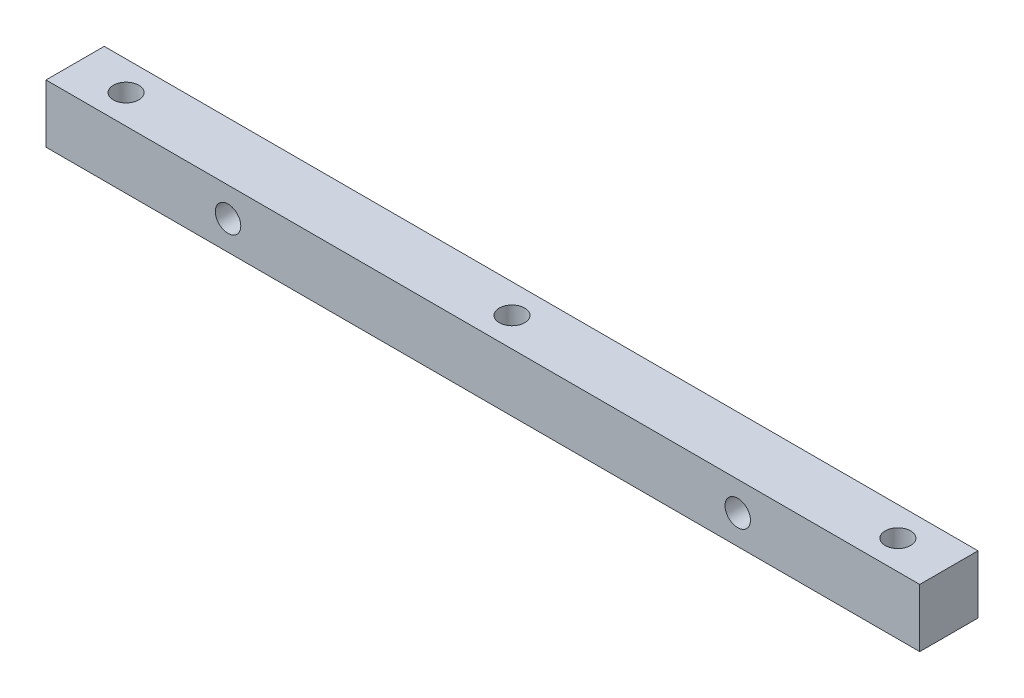
ISO-10303-21;
HEADER;
FILE_DESCRIPTION(('STEP AP214'),'2;1');
FILE_NAME('part.step','',(''),(''),'','','');
FILE_SCHEMA(('AUTOMOTIVE_DESIGN { 1 0 10303 214 1 1 1 1 }'));
ENDSEC;
DATA;
#1=APPLICATION_CONTEXT('core data for automotive mechanical design processes');
#2=APPLICATION_PROTOCOL_DEFINITION('international standard','automotive_design',2000,#1);
#3=PRODUCT_CONTEXT('',#1,'mechanical');
#4=PRODUCT('Part','Part','',(#3));
#5=PRODUCT_RELATED_PRODUCT_CATEGORY('part','',(#4));
#6=PRODUCT_DEFINITION_FORMATION('','',#4);
#7=PRODUCT_DEFINITION_CONTEXT('part definition',#1,'design');
#8=PRODUCT_DEFINITION('design','',#6,#7);
#9=PRODUCT_DEFINITION_SHAPE('','',#8);
#10=(LENGTH_UNIT() NAMED_UNIT(*) SI_UNIT(.MILLI.,.METRE.));
#11=(NAMED_UNIT(*) PLANE_ANGLE_UNIT() SI_UNIT($,.RADIAN.));
#12=(NAMED_UNIT(*) SI_UNIT($,.STERADIAN.) SOLID_ANGLE_UNIT());
#13=UNCERTAINTY_MEASURE_WITH_UNIT(LENGTH_MEASURE(1.E-05),#10,'distance_accuracy_value','');
#14=(GEOMETRIC_REPRESENTATION_CONTEXT(3) GLOBAL_UNCERTAINTY_ASSIGNED_CONTEXT((#13)) GLOBAL_UNIT_ASSIGNED_CONTEXT((#10,
#11,#12)) REPRESENTATION_CONTEXT('',''));
#15=CARTESIAN_POINT('',(0.,0.,0.));
#16=DIRECTION('',(0.,0.,1.));
#17=DIRECTION('',(1.,0.,0.));
#18=AXIS2_PLACEMENT_3D('',#15,#16,#17);
#19=CARTESIAN_POINT('',(0.,0.,8.));
#20=DIRECTION('',(0.,0.,-1.));
#21=DIRECTION('',(-1.,0.,0.));
#22=AXIS2_PLACEMENT_3D('',#19,#20,#21);
#23=PLANE('',#22);
#24=DIRECTION('',(0.,1.,0.));
#25=VECTOR('',#24,1.);
#26=CARTESIAN_POINT('',(60.,-4.,8.));
#27=LINE('',#26,#25);
#28=CARTESIAN_POINT('',(60.,-4.,8.));
#29=VERTEX_POINT('',#28);
#30=CARTESIAN_POINT('',(60.,4.,8.));
#31=VERTEX_POINT('',#30);
#32=EDGE_CURVE('E93',#29,#31,#27,.T.);
#33=ORIENTED_EDGE('',*,*,#32,.T.);
#34=DIRECTION('',(-1.,0.,0.));
#35=VECTOR('',#34,1.);
#36=CARTESIAN_POINT('',(-60.,4.,8.));
#37=LINE('',#36,#35);
#38=CARTESIAN_POINT('',(-60.,4.,8.));
#39=VERTEX_POINT('',#38);
#40=EDGE_CURVE('E88',#31,#39,#37,.T.);
#41=ORIENTED_EDGE('',*,*,#40,.T.);
#42=DIRECTION('',(0.,-1.,0.));
#43=VECTOR('',#42,1.);
#44=CARTESIAN_POINT('',(-60.,-4.,8.));
#45=LINE('',#44,#43);
#46=CARTESIAN_POINT('',(-60.,-4.,8.));
#47=VERTEX_POINT('',#46);
#48=EDGE_CURVE('E91',#39,#47,#45,.T.);
#49=ORIENTED_EDGE('',*,*,#48,.T.);
#50=DIRECTION('',(1.,0.,0.));
#51=VECTOR('',#50,1.);
#52=CARTESIAN_POINT('',(-60.,-4.,8.));
#53=LINE('',#52,#51);
#54=EDGE_CURVE('E58',#47,#29,#53,.T.);
#55=ORIENTED_EDGE('',*,*,#54,.T.);
#56=EDGE_LOOP('',(#33,#41,#49,#55));
#57=FACE_BOUND('',#56,.T.);
#58=CARTESIAN_POINT('',(-35.,0.,8.));
#59=DIRECTION('',(0.,0.,1.));
#60=DIRECTION('',(1.,0.,0.));
#61=AXIS2_PLACEMENT_3D('',#58,#59,#60);
#62=CIRCLE('',#61,1.75);
#63=CARTESIAN_POINT('',(-33.25,0.,8.));
#64=VERTEX_POINT('',#63);
#65=EDGE_CURVE('E108',#64,#64,#62,.T.);
#66=ORIENTED_EDGE('',*,*,#65,.F.);
#67=EDGE_LOOP('',(#66));
#68=FACE_BOUND('',#67,.T.);
#69=CARTESIAN_POINT('',(35.,0.,8.));
#70=DIRECTION('',(0.,0.,1.));
#71=DIRECTION('',(1.,0.,0.));
#72=AXIS2_PLACEMENT_3D('',#69,#70,#71);
#73=CIRCLE('',#72,1.75);
#74=CARTESIAN_POINT('',(36.75,0.,8.));
#75=VERTEX_POINT('',#74);
#76=EDGE_CURVE('E123',#75,#75,#73,.T.);
#77=ORIENTED_EDGE('',*,*,#76,.F.);
#78=EDGE_LOOP('',(#77));
#79=FACE_BOUND('',#78,.T.);
#80=ADVANCED_FACE('F41',(#57,#68,#79),#23,.F.);
#81=CARTESIAN_POINT('',(0.,0.,0.));
#82=DIRECTION('',(0.,0.,-1.));
#83=DIRECTION('',(-1.,0.,0.));
#84=AXIS2_PLACEMENT_3D('',#81,#82,#83);
#85=PLANE('',#84);
#86=CARTESIAN_POINT('',(-35.,0.,0.));
#87=DIRECTION('',(0.,0.,1.));
#88=DIRECTION('',(1.,0.,0.));
#89=AXIS2_PLACEMENT_3D('',#86,#87,#88);
#90=CIRCLE('',#89,1.75);
#91=CARTESIAN_POINT('',(-33.25,0.,0.));
#92=VERTEX_POINT('',#91);
#93=EDGE_CURVE('E120',#92,#92,#90,.T.);
#94=ORIENTED_EDGE('',*,*,#93,.T.);
#95=EDGE_LOOP('',(#94));
#96=FACE_BOUND('',#95,.T.);
#97=DIRECTION('',(0.,1.,0.));
#98=VECTOR('',#97,1.);
#99=CARTESIAN_POINT('',(60.,-4.,0.));
#100=LINE('',#99,#98);
#101=CARTESIAN_POINT('',(60.,-4.,0.));
#102=VERTEX_POINT('',#101);
#103=CARTESIAN_POINT('',(60.,4.,0.));
#104=VERTEX_POINT('',#103);
#105=EDGE_CURVE('E105',#102,#104,#100,.T.);
#106=ORIENTED_EDGE('',*,*,#105,.F.);
#107=DIRECTION('',(1.,0.,0.));
#108=VECTOR('',#107,1.);
#109=CARTESIAN_POINT('',(-60.,-4.,0.));
#110=LINE('',#109,#108);
#111=CARTESIAN_POINT('',(-60.,-4.,0.));
#112=VERTEX_POINT('',#111);
#113=EDGE_CURVE('E81',#112,#102,#110,.T.);
#114=ORIENTED_EDGE('',*,*,#113,.F.);
#115=DIRECTION('',(0.,-1.,0.));
#116=VECTOR('',#115,1.);
#117=CARTESIAN_POINT('',(-60.,-4.,0.));
#118=LINE('',#117,#116);
#119=CARTESIAN_POINT('',(-60.,4.,0.));
#120=VERTEX_POINT('',#119);
#121=EDGE_CURVE('E75',#120,#112,#118,.T.);
#122=ORIENTED_EDGE('',*,*,#121,.F.);
#123=DIRECTION('',(-1.,0.,0.));
#124=VECTOR('',#123,1.);
#125=CARTESIAN_POINT('',(-60.,4.,0.));
#126=LINE('',#125,#124);
#127=EDGE_CURVE('E97',#104,#120,#126,.T.);
#128=ORIENTED_EDGE('',*,*,#127,.F.);
#129=EDGE_LOOP('',(#106,#114,#122,#128));
#130=FACE_BOUND('',#129,.T.);
#131=CARTESIAN_POINT('',(35.,0.,0.));
#132=DIRECTION('',(0.,0.,1.));
#133=DIRECTION('',(1.,0.,0.));
#134=AXIS2_PLACEMENT_3D('',#131,#132,#133);
#135=CIRCLE('',#134,1.75);
#136=CARTESIAN_POINT('',(36.75,0.,0.));
#137=VERTEX_POINT('',#136);
#138=EDGE_CURVE('E126',#137,#137,#135,.T.);
#139=ORIENTED_EDGE('',*,*,#138,.T.);
#140=EDGE_LOOP('',(#139));
#141=FACE_BOUND('',#140,.T.);
#142=ADVANCED_FACE('F116',(#96,#130,#141),#85,.T.);
#143=CARTESIAN_POINT('',(60.,-4.,8.));
#144=DIRECTION('',(-1.,0.,0.));
#145=DIRECTION('',(0.,0.,1.));
#146=AXIS2_PLACEMENT_3D('',#143,#144,#145);
#147=PLANE('',#146);
#148=ORIENTED_EDGE('',*,*,#105,.T.);
#149=DIRECTION('',(0.,0.,-1.));
#150=VECTOR('',#149,1.);
#151=CARTESIAN_POINT('',(60.,4.,8.));
#152=LINE('',#151,#150);
#153=EDGE_CURVE('E11',#31,#104,#152,.T.);
#154=ORIENTED_EDGE('',*,*,#153,.F.);
#155=ORIENTED_EDGE('',*,*,#32,.F.);
#156=DIRECTION('',(0.,0.,-1.));
#157=VECTOR('',#156,1.);
#158=CARTESIAN_POINT('',(60.,-4.,8.));
#159=LINE('',#158,#157);
#160=EDGE_CURVE('E101',#29,#102,#159,.T.);
#161=ORIENTED_EDGE('',*,*,#160,.T.);
#162=EDGE_LOOP('',(#148,#154,#155,#161));
#163=FACE_BOUND('',#162,.T.);
#164=ADVANCED_FACE('F43',(#163),#147,.F.);
#165=CARTESIAN_POINT('',(-60.,4.,8.));
#166=DIRECTION('',(0.,-1.,0.));
#167=DIRECTION('',(0.,0.,-1.));
#168=AXIS2_PLACEMENT_3D('',#165,#166,#167);
#169=PLANE('',#168);
#170=CARTESIAN_POINT('',(53.,4.,4.));
#171=DIRECTION('',(0.,1.,0.));
#172=DIRECTION('',(0.,0.,1.));
#173=AXIS2_PLACEMENT_3D('',#170,#171,#172);
#174=CIRCLE('',#173,1.75);
#175=CARTESIAN_POINT('',(53.,4.,5.75));
#176=VERTEX_POINT('',#175);
#177=EDGE_CURVE('E144',#176,#176,#174,.T.);
#178=ORIENTED_EDGE('',*,*,#177,.F.);
#179=EDGE_LOOP('',(#178));
#180=FACE_BOUND('',#179,.T.);
#181=CARTESIAN_POINT('',(-53.,4.,4.00000000000001));
#182=DIRECTION('',(0.,1.,0.));
#183=DIRECTION('',(0.,0.,-1.));
#184=AXIS2_PLACEMENT_3D('',#181,#182,#183);
#185=CIRCLE('',#184,1.75000000000001);
#186=CARTESIAN_POINT('',(-53.,4.,2.25));
#187=VERTEX_POINT('',#186);
#188=EDGE_CURVE('E141',#187,#187,#185,.T.);
#189=ORIENTED_EDGE('',*,*,#188,.F.);
#190=EDGE_LOOP('',(#189));
#191=FACE_BOUND('',#190,.T.);
#192=CARTESIAN_POINT('',(0.,4.,4.));
#193=DIRECTION('',(0.,1.,0.));
#194=DIRECTION('',(0.,0.,1.));
#195=AXIS2_PLACEMENT_3D('',#192,#193,#194);
#196=CIRCLE('',#195,1.75);
#197=CARTESIAN_POINT('',(0.,4.,5.75));
#198=VERTEX_POINT('',#197);
#199=EDGE_CURVE('E135',#198,#198,#196,.T.);
#200=ORIENTED_EDGE('',*,*,#199,.F.);
#201=EDGE_LOOP('',(#200));
#202=FACE_BOUND('',#201,.T.);
#203=ORIENTED_EDGE('',*,*,#127,.T.);
#204=DIRECTION('',(0.,0.,-1.));
#205=VECTOR('',#204,1.);
#206=CARTESIAN_POINT('',(-60.,4.,8.));
#207=LINE('',#206,#205);
#208=EDGE_CURVE('E50',#39,#120,#207,.T.);
#209=ORIENTED_EDGE('',*,*,#208,.F.);
#210=ORIENTED_EDGE('',*,*,#40,.F.);
#211=ORIENTED_EDGE('',*,*,#153,.T.);
#212=EDGE_LOOP('',(#203,#209,#210,#211));
#213=FACE_BOUND('',#212,.T.);
#214=ADVANCED_FACE('F96',(#180,#191,#202,#213),#169,.F.);
#215=CARTESIAN_POINT('',(-60.,-4.,8.));
#216=DIRECTION('',(1.,0.,0.));
#217=DIRECTION('',(0.,1.,0.));
#218=AXIS2_PLACEMENT_3D('',#215,#216,#217);
#219=PLANE('',#218);
#220=ORIENTED_EDGE('',*,*,#121,.T.);
#221=DIRECTION('',(0.,0.,-1.));
#222=VECTOR('',#221,1.);
#223=CARTESIAN_POINT('',(-60.,-4.,8.));
#224=LINE('',#223,#222);
#225=EDGE_CURVE('E98',#47,#112,#224,.T.);
#226=ORIENTED_EDGE('',*,*,#225,.F.);
#227=ORIENTED_EDGE('',*,*,#48,.F.);
#228=ORIENTED_EDGE('',*,*,#208,.T.);
#229=EDGE_LOOP('',(#220,#226,#227,#228));
#230=FACE_BOUND('',#229,.T.);
#231=ADVANCED_FACE('F99',(#230),#219,.F.);
#232=CARTESIAN_POINT('',(-60.,-4.,8.));
#233=DIRECTION('',(0.,1.,0.));
#234=DIRECTION('',(-1.,0.,0.));
#235=AXIS2_PLACEMENT_3D('',#232,#233,#234);
#236=PLANE('',#235);
#237=CARTESIAN_POINT('',(53.,-4.,4.));
#238=DIRECTION('',(0.,1.,0.));
#239=DIRECTION('',(0.,0.,1.));
#240=AXIS2_PLACEMENT_3D('',#237,#238,#239);
#241=CIRCLE('',#240,1.75);
#242=CARTESIAN_POINT('',(53.,-4.,5.75));
#243=VERTEX_POINT('',#242);
#244=EDGE_CURVE('E129',#243,#243,#241,.T.);
#245=ORIENTED_EDGE('',*,*,#244,.T.);
#246=EDGE_LOOP('',(#245));
#247=FACE_BOUND('',#246,.T.);
#248=CARTESIAN_POINT('',(-53.,-4.,4.00000000000001));
#249=DIRECTION('',(0.,1.,0.));
#250=DIRECTION('',(0.,0.,-1.));
#251=AXIS2_PLACEMENT_3D('',#248,#249,#250);
#252=CIRCLE('',#251,1.75000000000001);
#253=CARTESIAN_POINT('',(-53.,-4.,2.25));
#254=VERTEX_POINT('',#253);
#255=EDGE_CURVE('E138',#254,#254,#252,.T.);
#256=ORIENTED_EDGE('',*,*,#255,.T.);
#257=EDGE_LOOP('',(#256));
#258=FACE_BOUND('',#257,.T.);
#259=CARTESIAN_POINT('',(0.,-4.,4.));
#260=DIRECTION('',(0.,1.,0.));
#261=DIRECTION('',(0.,0.,1.));
#262=AXIS2_PLACEMENT_3D('',#259,#260,#261);
#263=CIRCLE('',#262,1.75);
#264=CARTESIAN_POINT('',(0.,-4.,5.75));
#265=VERTEX_POINT('',#264);
#266=EDGE_CURVE('E132',#265,#265,#263,.T.);
#267=ORIENTED_EDGE('',*,*,#266,.T.);
#268=EDGE_LOOP('',(#267));
#269=FACE_BOUND('',#268,.T.);
#270=ORIENTED_EDGE('',*,*,#113,.T.);
#271=ORIENTED_EDGE('',*,*,#160,.F.);
#272=ORIENTED_EDGE('',*,*,#54,.F.);
#273=ORIENTED_EDGE('',*,*,#225,.T.);
#274=EDGE_LOOP('',(#270,#271,#272,#273));
#275=FACE_BOUND('',#274,.T.);
#276=ADVANCED_FACE('F113',(#247,#258,#269,#275),#236,.F.);
#277=CARTESIAN_POINT('',(-35.,0.,8.));
#278=DIRECTION('',(0.,0.,-1.));
#279=DIRECTION('',(-1.,0.,0.));
#280=AXIS2_PLACEMENT_3D('',#277,#278,#279);
#281=CYLINDRICAL_SURFACE('',#280,1.75);
#282=ORIENTED_EDGE('',*,*,#65,.T.);
#283=EDGE_LOOP('',(#282));
#284=FACE_BOUND('',#283,.T.);
#285=ORIENTED_EDGE('',*,*,#93,.F.);
#286=EDGE_LOOP('',(#285));
#287=FACE_BOUND('',#286,.T.);
#288=ADVANCED_FACE('F177',(#284,#287),#281,.F.);
#289=CARTESIAN_POINT('',(35.,0.,8.));
#290=DIRECTION('',(0.,0.,-1.));
#291=DIRECTION('',(-1.,0.,0.));
#292=AXIS2_PLACEMENT_3D('',#289,#290,#291);
#293=CYLINDRICAL_SURFACE('',#292,1.75);
#294=ORIENTED_EDGE('',*,*,#76,.T.);
#295=EDGE_LOOP('',(#294));
#296=FACE_BOUND('',#295,.T.);
#297=ORIENTED_EDGE('',*,*,#138,.F.);
#298=EDGE_LOOP('',(#297));
#299=FACE_BOUND('',#298,.T.);
#300=ADVANCED_FACE('F167',(#296,#299),#293,.F.);
#301=CARTESIAN_POINT('',(0.,-4.,4.));
#302=DIRECTION('',(0.,1.,0.));
#303=DIRECTION('',(0.,0.,1.));
#304=AXIS2_PLACEMENT_3D('',#301,#302,#303);
#305=CYLINDRICAL_SURFACE('',#304,1.75);
#306=ORIENTED_EDGE('',*,*,#266,.F.);
#307=EDGE_LOOP('',(#306));
#308=FACE_BOUND('',#307,.T.);
#309=ORIENTED_EDGE('',*,*,#199,.T.);
#310=EDGE_LOOP('',(#309));
#311=FACE_BOUND('',#310,.T.);
#312=ADVANCED_FACE('F165',(#308,#311),#305,.F.);
#313=CARTESIAN_POINT('',(-53.,-4.,4.00000000000001));
#314=DIRECTION('',(0.,1.,0.));
#315=DIRECTION('',(0.,0.,1.));
#316=AXIS2_PLACEMENT_3D('',#313,#314,#315);
#317=CYLINDRICAL_SURFACE('',#316,1.75000000000001);
#318=ORIENTED_EDGE('',*,*,#255,.F.);
#319=EDGE_LOOP('',(#318));
#320=FACE_BOUND('',#319,.T.);
#321=ORIENTED_EDGE('',*,*,#188,.T.);
#322=EDGE_LOOP('',(#321));
#323=FACE_BOUND('',#322,.T.);
#324=ADVANCED_FACE('F155',(#320,#323),#317,.F.);
#325=CARTESIAN_POINT('',(53.,-4.,4.));
#326=DIRECTION('',(0.,1.,0.));
#327=DIRECTION('',(0.,0.,1.));
#328=AXIS2_PLACEMENT_3D('',#325,#326,#327);
#329=CYLINDRICAL_SURFACE('',#328,1.75);
#330=ORIENTED_EDGE('',*,*,#244,.F.);
#331=EDGE_LOOP('',(#330));
#332=FACE_BOUND('',#331,.T.);
#333=ORIENTED_EDGE('',*,*,#177,.T.);
#334=EDGE_LOOP('',(#333));
#335=FACE_BOUND('',#334,.T.);
#336=ADVANCED_FACE('F152',(#332,#335),#329,.F.);
#337=CLOSED_SHELL('',(#80,#142,#164,#214,#231,#276,#288,#300,#312,#324,#336));
#338=MANIFOLD_SOLID_BREP('B2',#337);
#339=ADVANCED_BREP_SHAPE_REPRESENTATION('',(#18,#338),#14);
#340=SHAPE_DEFINITION_REPRESENTATION(#9,#339);
ENDSEC;
END-ISO-10303-21;
